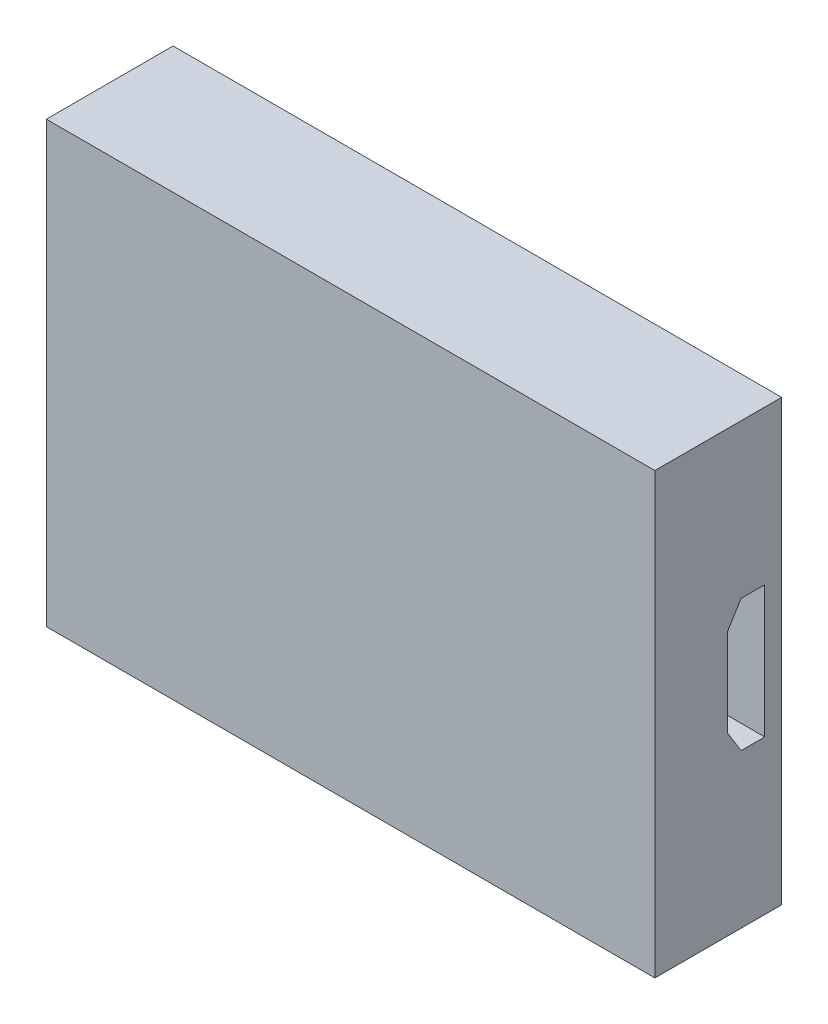
ISO-10303-21;
HEADER;
FILE_DESCRIPTION(('STEP AP214'),'2;1');
FILE_NAME('part.step','',(''),(''),'','','');
FILE_SCHEMA(('AUTOMOTIVE_DESIGN { 1 0 10303 214 1 1 1 1 }'));
ENDSEC;
DATA;
#1=APPLICATION_CONTEXT('core data for automotive mechanical design processes');
#2=APPLICATION_PROTOCOL_DEFINITION('international standard','automotive_design',2000,#1);
#3=PRODUCT_CONTEXT('',#1,'mechanical');
#4=PRODUCT('Part','Part','',(#3));
#5=PRODUCT_RELATED_PRODUCT_CATEGORY('part','',(#4));
#6=PRODUCT_DEFINITION_FORMATION('','',#4);
#7=PRODUCT_DEFINITION_CONTEXT('part definition',#1,'design');
#8=PRODUCT_DEFINITION('design','',#6,#7);
#9=PRODUCT_DEFINITION_SHAPE('','',#8);
#10=(LENGTH_UNIT() NAMED_UNIT(*) SI_UNIT(.MILLI.,.METRE.));
#11=(NAMED_UNIT(*) PLANE_ANGLE_UNIT() SI_UNIT($,.RADIAN.));
#12=(NAMED_UNIT(*) SI_UNIT($,.STERADIAN.) SOLID_ANGLE_UNIT());
#13=UNCERTAINTY_MEASURE_WITH_UNIT(LENGTH_MEASURE(1.E-05),#10,'distance_accuracy_value','');
#14=(GEOMETRIC_REPRESENTATION_CONTEXT(3) GLOBAL_UNCERTAINTY_ASSIGNED_CONTEXT((#13)) GLOBAL_UNIT_ASSIGNED_CONTEXT((#10,
#11,#12)) REPRESENTATION_CONTEXT('',''));
#15=CARTESIAN_POINT('',(0.,0.,0.));
#16=DIRECTION('',(0.,0.,1.));
#17=DIRECTION('',(1.,0.,0.));
#18=AXIS2_PLACEMENT_3D('',#15,#16,#17);
#19=CARTESIAN_POINT('',(0.,13.,-5.5));
#20=DIRECTION('',(0.,1.,0.));
#21=DIRECTION('',(-1.,0.,0.));
#22=AXIS2_PLACEMENT_3D('',#19,#20,#21);
#23=PLANE('',#22);
#24=DIRECTION('',(0.,0.,1.));
#25=VECTOR('',#24,1.);
#26=CARTESIAN_POINT('',(-19.25,13.,-5.5));
#27=LINE('',#26,#25);
#28=CARTESIAN_POINT('',(-19.25,13.,-5.5));
#29=VERTEX_POINT('',#28);
#30=CARTESIAN_POINT('',(-19.25,13.,2.));
#31=VERTEX_POINT('',#30);
#32=EDGE_CURVE('E61',#29,#31,#27,.T.);
#33=ORIENTED_EDGE('',*,*,#32,.T.);
#34=DIRECTION('',(-1.,0.,0.));
#35=VECTOR('',#34,1.);
#36=CARTESIAN_POINT('',(0.,13.,2.));
#37=LINE('',#36,#35);
#38=CARTESIAN_POINT('',(16.75,13.,2.));
#39=VERTEX_POINT('',#38);
#40=EDGE_CURVE('E171',#39,#31,#37,.T.);
#41=ORIENTED_EDGE('',*,*,#40,.F.);
#42=DIRECTION('',(0.,0.,1.));
#43=VECTOR('',#42,1.);
#44=CARTESIAN_POINT('',(16.75,13.,-5.5));
#45=LINE('',#44,#43);
#46=CARTESIAN_POINT('',(16.75,13.,-5.5));
#47=VERTEX_POINT('',#46);
#48=EDGE_CURVE('E12',#47,#39,#45,.T.);
#49=ORIENTED_EDGE('',*,*,#48,.F.);
#50=DIRECTION('',(-1.,0.,0.));
#51=VECTOR('',#50,1.);
#52=CARTESIAN_POINT('',(0.,13.,-5.5));
#53=LINE('',#52,#51);
#54=EDGE_CURVE('E258',#47,#29,#53,.T.);
#55=ORIENTED_EDGE('',*,*,#54,.T.);
#56=EDGE_LOOP('',(#33,#41,#49,#55));
#57=FACE_BOUND('',#56,.T.);
#58=ADVANCED_FACE('F58',(#57),#23,.T.);
#59=CARTESIAN_POINT('',(16.75,0.,-5.5));
#60=DIRECTION('',(-1.,0.,0.));
#61=DIRECTION('',(0.,-1.,0.));
#62=AXIS2_PLACEMENT_3D('',#59,#60,#61);
#63=PLANE('',#62);
#64=DIRECTION('',(0.,-0.851658316704544,0.524097425664335));
#65=VECTOR('',#64,1.);
#66=CARTESIAN_POINT('',(16.75,3.9,-3.1));
#67=LINE('',#66,#65);
#68=CARTESIAN_POINT('',(16.75,3.9,-3.1));
#69=VERTEX_POINT('',#68);
#70=CARTESIAN_POINT('',(16.75,2.6,-2.3));
#71=VERTEX_POINT('',#70);
#72=EDGE_CURVE('E207',#69,#71,#67,.T.);
#73=ORIENTED_EDGE('',*,*,#72,.F.);
#74=DIRECTION('',(0.,0.,1.));
#75=VECTOR('',#74,1.);
#76=CARTESIAN_POINT('',(16.75,3.9,-4.5));
#77=LINE('',#76,#75);
#78=CARTESIAN_POINT('',(16.75,3.9,-4.5));
#79=VERTEX_POINT('',#78);
#80=EDGE_CURVE('E74',#79,#69,#77,.T.);
#81=ORIENTED_EDGE('',*,*,#80,.F.);
#82=DIRECTION('',(0.,1.,0.));
#83=VECTOR('',#82,1.);
#84=CARTESIAN_POINT('',(16.75,-3.9,-4.5));
#85=LINE('',#84,#83);
#86=CARTESIAN_POINT('',(16.75,-3.9,-4.5));
#87=VERTEX_POINT('',#86);
#88=EDGE_CURVE('E194',#87,#79,#85,.T.);
#89=ORIENTED_EDGE('',*,*,#88,.F.);
#90=DIRECTION('',(0.,0.,-1.));
#91=VECTOR('',#90,1.);
#92=CARTESIAN_POINT('',(16.75,-3.9,-4.5));
#93=LINE('',#92,#91);
#94=CARTESIAN_POINT('',(16.75,-3.9,-3.1));
#95=VERTEX_POINT('',#94);
#96=EDGE_CURVE('E198',#95,#87,#93,.T.);
#97=ORIENTED_EDGE('',*,*,#96,.F.);
#98=DIRECTION('',(0.,-0.851658316704544,-0.524097425664335));
#99=VECTOR('',#98,1.);
#100=CARTESIAN_POINT('',(16.75,-3.9,-3.1));
#101=LINE('',#100,#99);
#102=CARTESIAN_POINT('',(16.75,-2.6,-2.3));
#103=VERTEX_POINT('',#102);
#104=EDGE_CURVE('E201',#103,#95,#101,.T.);
#105=ORIENTED_EDGE('',*,*,#104,.F.);
#106=DIRECTION('',(0.,-1.,0.));
#107=VECTOR('',#106,1.);
#108=CARTESIAN_POINT('',(16.75,-2.6,-2.3));
#109=LINE('',#108,#107);
#110=EDGE_CURVE('E204',#71,#103,#109,.T.);
#111=ORIENTED_EDGE('',*,*,#110,.F.);
#112=EDGE_LOOP('',(#73,#81,#89,#97,#105,#111));
#113=FACE_BOUND('',#112,.T.);
#114=ORIENTED_EDGE('',*,*,#48,.T.);
#115=DIRECTION('',(0.,-1.,0.));
#116=VECTOR('',#115,1.);
#117=CARTESIAN_POINT('',(16.75,0.,2.));
#118=LINE('',#117,#116);
#119=CARTESIAN_POINT('',(16.75,-13.,2.));
#120=VERTEX_POINT('',#119);
#121=EDGE_CURVE('E164',#39,#120,#118,.T.);
#122=ORIENTED_EDGE('',*,*,#121,.T.);
#123=DIRECTION('',(0.,0.,1.));
#124=VECTOR('',#123,1.);
#125=CARTESIAN_POINT('',(16.75,-13.,-5.5));
#126=LINE('',#125,#124);
#127=CARTESIAN_POINT('',(16.75,-13.,-5.5));
#128=VERTEX_POINT('',#127);
#129=EDGE_CURVE('E66',#128,#120,#126,.T.);
#130=ORIENTED_EDGE('',*,*,#129,.F.);
#131=DIRECTION('',(0.,-1.,0.));
#132=VECTOR('',#131,1.);
#133=CARTESIAN_POINT('',(16.75,0.,-5.5));
#134=LINE('',#133,#132);
#135=EDGE_CURVE('E166',#47,#128,#134,.T.);
#136=ORIENTED_EDGE('',*,*,#135,.F.);
#137=EDGE_LOOP('',(#114,#122,#130,#136));
#138=FACE_BOUND('',#137,.T.);
#139=ADVANCED_FACE('F161',(#113,#138),#63,.F.);
#140=CARTESIAN_POINT('',(0.,-13.,-5.5));
#141=DIRECTION('',(0.,1.,0.));
#142=DIRECTION('',(-1.,0.,0.));
#143=AXIS2_PLACEMENT_3D('',#140,#141,#142);
#144=PLANE('',#143);
#145=ORIENTED_EDGE('',*,*,#129,.T.);
#146=DIRECTION('',(-1.,0.,0.));
#147=VECTOR('',#146,1.);
#148=CARTESIAN_POINT('',(0.,-13.,2.));
#149=LINE('',#148,#147);
#150=CARTESIAN_POINT('',(-19.25,-13.,2.));
#151=VERTEX_POINT('',#150);
#152=EDGE_CURVE('E179',#120,#151,#149,.T.);
#153=ORIENTED_EDGE('',*,*,#152,.T.);
#154=DIRECTION('',(0.,0.,1.));
#155=VECTOR('',#154,1.);
#156=CARTESIAN_POINT('',(-19.25,-13.,-5.5));
#157=LINE('',#156,#155);
#158=CARTESIAN_POINT('',(-19.25,-13.,-5.5));
#159=VERTEX_POINT('',#158);
#160=EDGE_CURVE('E274',#159,#151,#157,.T.);
#161=ORIENTED_EDGE('',*,*,#160,.F.);
#162=DIRECTION('',(-1.,0.,0.));
#163=VECTOR('',#162,1.);
#164=CARTESIAN_POINT('',(0.,-13.,-5.5));
#165=LINE('',#164,#163);
#166=EDGE_CURVE('E271',#128,#159,#165,.T.);
#167=ORIENTED_EDGE('',*,*,#166,.F.);
#168=EDGE_LOOP('',(#145,#153,#161,#167));
#169=FACE_BOUND('',#168,.T.);
#170=ADVANCED_FACE('F281',(#169),#144,.F.);
#171=CARTESIAN_POINT('',(-19.25,0.,-5.5));
#172=DIRECTION('',(-1.,0.,0.));
#173=DIRECTION('',(0.,-1.,0.));
#174=AXIS2_PLACEMENT_3D('',#171,#172,#173);
#175=PLANE('',#174);
#176=CARTESIAN_POINT('',(-19.25,4.2,-2.5));
#177=DIRECTION('',(-1.,0.,0.));
#178=DIRECTION('',(0.,-1.,0.));
#179=AXIS2_PLACEMENT_3D('',#176,#177,#178);
#180=CIRCLE('',#179,0.5);
#181=CARTESIAN_POINT('',(-19.25,3.7,-2.5));
#182=VERTEX_POINT('',#181);
#183=EDGE_CURVE('E424',#182,#182,#180,.T.);
#184=ORIENTED_EDGE('',*,*,#183,.F.);
#185=EDGE_LOOP('',(#184));
#186=FACE_BOUND('',#185,.T.);
#187=CARTESIAN_POINT('',(-19.25,-4.2,-2.5));
#188=DIRECTION('',(-1.,0.,0.));
#189=DIRECTION('',(0.,1.,0.));
#190=AXIS2_PLACEMENT_3D('',#187,#188,#189);
#191=CIRCLE('',#190,0.5);
#192=CARTESIAN_POINT('',(-19.25,-3.7,-2.5));
#193=VERTEX_POINT('',#192);
#194=EDGE_CURVE('E432',#193,#193,#191,.T.);
#195=ORIENTED_EDGE('',*,*,#194,.F.);
#196=EDGE_LOOP('',(#195));
#197=FACE_BOUND('',#196,.T.);
#198=ORIENTED_EDGE('',*,*,#160,.T.);
#199=DIRECTION('',(0.,-1.,0.));
#200=VECTOR('',#199,1.);
#201=CARTESIAN_POINT('',(-19.25,0.,2.));
#202=LINE('',#201,#200);
#203=EDGE_CURVE('E175',#31,#151,#202,.T.);
#204=ORIENTED_EDGE('',*,*,#203,.F.);
#205=ORIENTED_EDGE('',*,*,#32,.F.);
#206=DIRECTION('',(0.,-1.,0.));
#207=VECTOR('',#206,1.);
#208=CARTESIAN_POINT('',(-19.25,0.,-5.5));
#209=LINE('',#208,#207);
#210=EDGE_CURVE('E268',#29,#159,#209,.T.);
#211=ORIENTED_EDGE('',*,*,#210,.T.);
#212=EDGE_LOOP('',(#198,#204,#205,#211));
#213=FACE_BOUND('',#212,.T.);
#214=ADVANCED_FACE('F277',(#186,#197,#213),#175,.T.);
#215=CARTESIAN_POINT('',(0.,0.,-5.5));
#216=DIRECTION('',(0.,0.,1.));
#217=DIRECTION('',(1.,0.,0.));
#218=AXIS2_PLACEMENT_3D('',#215,#216,#217);
#219=PLANE('',#218);
#220=CARTESIAN_POINT('',(14.7499999999998,-11.,-5.5));
#221=DIRECTION('',(0.,0.,-1.));
#222=DIRECTION('',(-1.,0.,0.));
#223=AXIS2_PLACEMENT_3D('',#220,#221,#222);
#224=CIRCLE('',#223,1.25);
#225=CARTESIAN_POINT('',(13.4999999999998,-11.,-5.5));
#226=VERTEX_POINT('',#225);
#227=EDGE_CURVE('E425',#226,#226,#224,.T.);
#228=ORIENTED_EDGE('',*,*,#227,.F.);
#229=EDGE_LOOP('',(#228));
#230=FACE_BOUND('',#229,.T.);
#231=CARTESIAN_POINT('',(-17.2500000000002,-11.,-5.5));
#232=DIRECTION('',(0.,0.,-1.));
#233=DIRECTION('',(-1.,0.,0.));
#234=AXIS2_PLACEMENT_3D('',#231,#232,#233);
#235=CIRCLE('',#234,1.25);
#236=CARTESIAN_POINT('',(-18.5000000000002,-11.,-5.5));
#237=VERTEX_POINT('',#236);
#238=EDGE_CURVE('E445',#237,#237,#235,.T.);
#239=ORIENTED_EDGE('',*,*,#238,.F.);
#240=EDGE_LOOP('',(#239));
#241=FACE_BOUND('',#240,.T.);
#242=CARTESIAN_POINT('',(-17.25,11.,-5.5));
#243=DIRECTION('',(0.,0.,-1.));
#244=DIRECTION('',(-1.,0.,0.));
#245=AXIS2_PLACEMENT_3D('',#242,#243,#244);
#246=CIRCLE('',#245,1.25);
#247=CARTESIAN_POINT('',(-18.5,11.,-5.5));
#248=VERTEX_POINT('',#247);
#249=EDGE_CURVE('E439',#248,#248,#246,.T.);
#250=ORIENTED_EDGE('',*,*,#249,.F.);
#251=EDGE_LOOP('',(#250));
#252=FACE_BOUND('',#251,.T.);
#253=CARTESIAN_POINT('',(14.75,11.,-5.5));
#254=DIRECTION('',(0.,0.,-1.));
#255=DIRECTION('',(-1.,0.,0.));
#256=AXIS2_PLACEMENT_3D('',#253,#254,#255);
#257=CIRCLE('',#256,1.25);
#258=CARTESIAN_POINT('',(13.5,11.,-5.5));
#259=VERTEX_POINT('',#258);
#260=EDGE_CURVE('E183',#259,#259,#257,.T.);
#261=ORIENTED_EDGE('',*,*,#260,.F.);
#262=EDGE_LOOP('',(#261));
#263=FACE_BOUND('',#262,.T.);
#264=DIRECTION('',(0.,-1.,0.));
#265=VECTOR('',#264,1.);
#266=CARTESIAN_POINT('',(13.75,0.,-5.5));
#267=LINE('',#266,#265);
#268=CARTESIAN_POINT('',(13.75,10.,-5.5));
#269=VERTEX_POINT('',#268);
#270=CARTESIAN_POINT('',(13.75,-10.,-5.5));
#271=VERTEX_POINT('',#270);
#272=EDGE_CURVE('E244',#269,#271,#267,.T.);
#273=ORIENTED_EDGE('',*,*,#272,.F.);
#274=DIRECTION('',(-1.,0.,0.));
#275=VECTOR('',#274,1.);
#276=CARTESIAN_POINT('',(0.,10.,-5.5));
#277=LINE('',#276,#275);
#278=CARTESIAN_POINT('',(-16.25,10.,-5.5));
#279=VERTEX_POINT('',#278);
#280=EDGE_CURVE('E234',#269,#279,#277,.T.);
#281=ORIENTED_EDGE('',*,*,#280,.T.);
#282=DIRECTION('',(0.,-1.,0.));
#283=VECTOR('',#282,1.);
#284=CARTESIAN_POINT('',(-16.25,0.,-5.5));
#285=LINE('',#284,#283);
#286=CARTESIAN_POINT('',(-16.25,-10.,-5.5));
#287=VERTEX_POINT('',#286);
#288=EDGE_CURVE('E237',#279,#287,#285,.T.);
#289=ORIENTED_EDGE('',*,*,#288,.T.);
#290=DIRECTION('',(-1.,0.,0.));
#291=VECTOR('',#290,1.);
#292=CARTESIAN_POINT('',(0.,-10.,-5.5));
#293=LINE('',#292,#291);
#294=EDGE_CURVE('E241',#271,#287,#293,.T.);
#295=ORIENTED_EDGE('',*,*,#294,.F.);
#296=EDGE_LOOP('',(#273,#281,#289,#295));
#297=FACE_BOUND('',#296,.T.);
#298=ORIENTED_EDGE('',*,*,#54,.F.);
#299=ORIENTED_EDGE('',*,*,#135,.T.);
#300=ORIENTED_EDGE('',*,*,#166,.T.);
#301=ORIENTED_EDGE('',*,*,#210,.F.);
#302=EDGE_LOOP('',(#298,#299,#300,#301));
#303=FACE_BOUND('',#302,.T.);
#304=ADVANCED_FACE('F283',(#230,#241,#252,#263,#297,#303),#219,.F.);
#305=CARTESIAN_POINT('',(0.,10.,-5.5));
#306=DIRECTION('',(0.,1.,0.));
#307=DIRECTION('',(-1.,0.,0.));
#308=AXIS2_PLACEMENT_3D('',#305,#306,#307);
#309=PLANE('',#308);
#310=DIRECTION('',(-1.,0.,0.));
#311=VECTOR('',#310,1.);
#312=CARTESIAN_POINT('',(0.,10.,0.));
#313=LINE('',#312,#311);
#314=CARTESIAN_POINT('',(13.75,10.,0.));
#315=VERTEX_POINT('',#314);
#316=CARTESIAN_POINT('',(-16.25,10.,0.));
#317=VERTEX_POINT('',#316);
#318=EDGE_CURVE('E197',#315,#317,#313,.T.);
#319=ORIENTED_EDGE('',*,*,#318,.T.);
#320=DIRECTION('',(0.,0.,1.));
#321=VECTOR('',#320,1.);
#322=CARTESIAN_POINT('',(-16.25,10.,-5.5));
#323=LINE('',#322,#321);
#324=EDGE_CURVE('E246',#279,#317,#323,.T.);
#325=ORIENTED_EDGE('',*,*,#324,.F.);
#326=ORIENTED_EDGE('',*,*,#280,.F.);
#327=DIRECTION('',(0.,0.,1.));
#328=VECTOR('',#327,1.);
#329=CARTESIAN_POINT('',(13.75,10.,-5.5));
#330=LINE('',#329,#328);
#331=EDGE_CURVE('E255',#269,#315,#330,.T.);
#332=ORIENTED_EDGE('',*,*,#331,.T.);
#333=EDGE_LOOP('',(#319,#325,#326,#332));
#334=FACE_BOUND('',#333,.T.);
#335=ADVANCED_FACE('F285',(#334),#309,.F.);
#336=CARTESIAN_POINT('',(13.75,0.,-5.5));
#337=DIRECTION('',(-1.,0.,0.));
#338=DIRECTION('',(0.,-1.,0.));
#339=AXIS2_PLACEMENT_3D('',#336,#337,#338);
#340=PLANE('',#339);
#341=DIRECTION('',(0.,0.,1.));
#342=VECTOR('',#341,1.);
#343=CARTESIAN_POINT('',(13.75,3.9,-4.5));
#344=LINE('',#343,#342);
#345=CARTESIAN_POINT('',(13.75,3.9,-4.5));
#346=VERTEX_POINT('',#345);
#347=CARTESIAN_POINT('',(13.75,3.9,-3.1));
#348=VERTEX_POINT('',#347);
#349=EDGE_CURVE('E189',#346,#348,#344,.T.);
#350=ORIENTED_EDGE('',*,*,#349,.T.);
#351=DIRECTION('',(0.,-0.851658316704544,0.524097425664335));
#352=VECTOR('',#351,1.);
#353=CARTESIAN_POINT('',(13.75,3.9,-3.1));
#354=LINE('',#353,#352);
#355=CARTESIAN_POINT('',(13.75,2.6,-2.3));
#356=VERTEX_POINT('',#355);
#357=EDGE_CURVE('E190',#348,#356,#354,.T.);
#358=ORIENTED_EDGE('',*,*,#357,.T.);
#359=DIRECTION('',(0.,-1.,0.));
#360=VECTOR('',#359,1.);
#361=CARTESIAN_POINT('',(13.75,-2.6,-2.3));
#362=LINE('',#361,#360);
#363=CARTESIAN_POINT('',(13.75,-2.6,-2.3));
#364=VERTEX_POINT('',#363);
#365=EDGE_CURVE('E225',#356,#364,#362,.T.);
#366=ORIENTED_EDGE('',*,*,#365,.T.);
#367=DIRECTION('',(0.,-0.851658316704544,-0.524097425664335));
#368=VECTOR('',#367,1.);
#369=CARTESIAN_POINT('',(13.75,-3.9,-3.1));
#370=LINE('',#369,#368);
#371=CARTESIAN_POINT('',(13.75,-3.9,-3.1));
#372=VERTEX_POINT('',#371);
#373=EDGE_CURVE('E221',#364,#372,#370,.T.);
#374=ORIENTED_EDGE('',*,*,#373,.T.);
#375=DIRECTION('',(0.,0.,-1.));
#376=VECTOR('',#375,1.);
#377=CARTESIAN_POINT('',(13.75,-3.9,-4.5));
#378=LINE('',#377,#376);
#379=CARTESIAN_POINT('',(13.75,-3.9,-4.5));
#380=VERTEX_POINT('',#379);
#381=EDGE_CURVE('E217',#372,#380,#378,.T.);
#382=ORIENTED_EDGE('',*,*,#381,.T.);
#383=DIRECTION('',(0.,1.,0.));
#384=VECTOR('',#383,1.);
#385=CARTESIAN_POINT('',(13.75,-3.9,-4.5));
#386=LINE('',#385,#384);
#387=EDGE_CURVE('E213',#380,#346,#386,.T.);
#388=ORIENTED_EDGE('',*,*,#387,.T.);
#389=EDGE_LOOP('',(#350,#358,#366,#374,#382,#388));
#390=FACE_BOUND('',#389,.T.);
#391=DIRECTION('',(0.,-1.,0.));
#392=VECTOR('',#391,1.);
#393=CARTESIAN_POINT('',(13.75,0.,0.));
#394=LINE('',#393,#392);
#395=CARTESIAN_POINT('',(13.75,-10.,0.));
#396=VERTEX_POINT('',#395);
#397=EDGE_CURVE('E238',#315,#396,#394,.T.);
#398=ORIENTED_EDGE('',*,*,#397,.F.);
#399=ORIENTED_EDGE('',*,*,#331,.F.);
#400=ORIENTED_EDGE('',*,*,#272,.T.);
#401=DIRECTION('',(0.,0.,1.));
#402=VECTOR('',#401,1.);
#403=CARTESIAN_POINT('',(13.75,-10.,-5.5));
#404=LINE('',#403,#402);
#405=EDGE_CURVE('E259',#271,#396,#404,.T.);
#406=ORIENTED_EDGE('',*,*,#405,.T.);
#407=EDGE_LOOP('',(#398,#399,#400,#406));
#408=FACE_BOUND('',#407,.T.);
#409=ADVANCED_FACE('F292',(#390,#408),#340,.T.);
#410=CARTESIAN_POINT('',(0.,-10.,-5.5));
#411=DIRECTION('',(0.,1.,0.));
#412=DIRECTION('',(-1.,0.,0.));
#413=AXIS2_PLACEMENT_3D('',#410,#411,#412);
#414=PLANE('',#413);
#415=DIRECTION('',(-1.,0.,0.));
#416=VECTOR('',#415,1.);
#417=CARTESIAN_POINT('',(0.,-10.,0.));
#418=LINE('',#417,#416);
#419=CARTESIAN_POINT('',(-16.25,-10.,0.));
#420=VERTEX_POINT('',#419);
#421=EDGE_CURVE('E252',#396,#420,#418,.T.);
#422=ORIENTED_EDGE('',*,*,#421,.F.);
#423=ORIENTED_EDGE('',*,*,#405,.F.);
#424=ORIENTED_EDGE('',*,*,#294,.T.);
#425=DIRECTION('',(0.,0.,1.));
#426=VECTOR('',#425,1.);
#427=CARTESIAN_POINT('',(-16.25,-10.,-5.5));
#428=LINE('',#427,#426);
#429=EDGE_CURVE('E262',#287,#420,#428,.T.);
#430=ORIENTED_EDGE('',*,*,#429,.T.);
#431=EDGE_LOOP('',(#422,#423,#424,#430));
#432=FACE_BOUND('',#431,.T.);
#433=ADVANCED_FACE('F349',(#432),#414,.T.);
#434=CARTESIAN_POINT('',(-16.25,0.,-5.5));
#435=DIRECTION('',(-1.,0.,0.));
#436=DIRECTION('',(0.,-1.,0.));
#437=AXIS2_PLACEMENT_3D('',#434,#435,#436);
#438=PLANE('',#437);
#439=CARTESIAN_POINT('',(-16.25,4.2,-2.5));
#440=DIRECTION('',(-1.,0.,0.));
#441=DIRECTION('',(0.,-1.,0.));
#442=AXIS2_PLACEMENT_3D('',#439,#440,#441);
#443=CIRCLE('',#442,0.5);
#444=CARTESIAN_POINT('',(-16.25,3.7,-2.5));
#445=VERTEX_POINT('',#444);
#446=EDGE_CURVE('E360',#445,#445,#443,.F.);
#447=ORIENTED_EDGE('',*,*,#446,.F.);
#448=EDGE_LOOP('',(#447));
#449=FACE_BOUND('',#448,.T.);
#450=CARTESIAN_POINT('',(-16.25,-4.2,-2.5));
#451=DIRECTION('',(-1.,0.,0.));
#452=DIRECTION('',(0.,-1.,0.));
#453=AXIS2_PLACEMENT_3D('',#450,#451,#452);
#454=CIRCLE('',#453,0.5);
#455=CARTESIAN_POINT('',(-16.25,-4.7,-2.5));
#456=VERTEX_POINT('',#455);
#457=EDGE_CURVE('E364',#456,#456,#454,.F.);
#458=ORIENTED_EDGE('',*,*,#457,.F.);
#459=EDGE_LOOP('',(#458));
#460=FACE_BOUND('',#459,.T.);
#461=DIRECTION('',(0.,-1.,0.));
#462=VECTOR('',#461,1.);
#463=CARTESIAN_POINT('',(-16.25,0.,0.));
#464=LINE('',#463,#462);
#465=EDGE_CURVE('E249',#317,#420,#464,.T.);
#466=ORIENTED_EDGE('',*,*,#465,.T.);
#467=ORIENTED_EDGE('',*,*,#429,.F.);
#468=ORIENTED_EDGE('',*,*,#288,.F.);
#469=ORIENTED_EDGE('',*,*,#324,.T.);
#470=EDGE_LOOP('',(#466,#467,#468,#469));
#471=FACE_BOUND('',#470,.T.);
#472=ADVANCED_FACE('F346',(#449,#460,#471),#438,.F.);
#473=CARTESIAN_POINT('',(-19.251,3.9,-4.5));
#474=DIRECTION('',(0.,1.,0.));
#475=DIRECTION('',(0.,0.,1.));
#476=AXIS2_PLACEMENT_3D('',#473,#474,#475);
#477=PLANE('',#476);
#478=DIRECTION('',(1.,0.,0.));
#479=VECTOR('',#478,1.);
#480=CARTESIAN_POINT('',(-19.251,3.9,-4.5));
#481=LINE('',#480,#479);
#482=EDGE_CURVE('E216',#346,#79,#481,.T.);
#483=ORIENTED_EDGE('',*,*,#482,.T.);
#484=ORIENTED_EDGE('',*,*,#80,.T.);
#485=DIRECTION('',(1.,0.,0.));
#486=VECTOR('',#485,1.);
#487=CARTESIAN_POINT('',(-19.251,3.9,-3.1));
#488=LINE('',#487,#486);
#489=EDGE_CURVE('E212',#348,#69,#488,.T.);
#490=ORIENTED_EDGE('',*,*,#489,.F.);
#491=ORIENTED_EDGE('',*,*,#349,.F.);
#492=EDGE_LOOP('',(#483,#484,#490,#491));
#493=FACE_BOUND('',#492,.T.);
#494=ADVANCED_FACE('F313',(#493),#477,.F.);
#495=CARTESIAN_POINT('',(-19.251,-3.9,-4.5));
#496=DIRECTION('',(0.,0.,-1.));
#497=DIRECTION('',(-1.,0.,0.));
#498=AXIS2_PLACEMENT_3D('',#495,#496,#497);
#499=PLANE('',#498);
#500=DIRECTION('',(1.,0.,0.));
#501=VECTOR('',#500,1.);
#502=CARTESIAN_POINT('',(-19.251,-3.9,-4.5));
#503=LINE('',#502,#501);
#504=EDGE_CURVE('E220',#380,#87,#503,.T.);
#505=ORIENTED_EDGE('',*,*,#504,.T.);
#506=ORIENTED_EDGE('',*,*,#88,.T.);
#507=ORIENTED_EDGE('',*,*,#482,.F.);
#508=ORIENTED_EDGE('',*,*,#387,.F.);
#509=EDGE_LOOP('',(#505,#506,#507,#508));
#510=FACE_BOUND('',#509,.T.);
#511=ADVANCED_FACE('F319',(#510),#499,.F.);
#512=CARTESIAN_POINT('',(-19.251,-3.9,-4.5));
#513=DIRECTION('',(0.,-1.,0.));
#514=DIRECTION('',(0.,0.,-1.));
#515=AXIS2_PLACEMENT_3D('',#512,#513,#514);
#516=PLANE('',#515);
#517=DIRECTION('',(1.,0.,0.));
#518=VECTOR('',#517,1.);
#519=CARTESIAN_POINT('',(-19.251,-3.9,-3.1));
#520=LINE('',#519,#518);
#521=EDGE_CURVE('E224',#372,#95,#520,.T.);
#522=ORIENTED_EDGE('',*,*,#521,.T.);
#523=ORIENTED_EDGE('',*,*,#96,.T.);
#524=ORIENTED_EDGE('',*,*,#504,.F.);
#525=ORIENTED_EDGE('',*,*,#381,.F.);
#526=EDGE_LOOP('',(#522,#523,#524,#525));
#527=FACE_BOUND('',#526,.T.);
#528=ADVANCED_FACE('F321',(#527),#516,.F.);
#529=CARTESIAN_POINT('',(-19.251,-3.9,-3.1));
#530=DIRECTION('',(0.,-0.524097425664335,0.851658316704544));
#531=DIRECTION('',(0.,-0.851658316704544,-0.524097425664335));
#532=AXIS2_PLACEMENT_3D('',#529,#530,#531);
#533=PLANE('',#532);
#534=DIRECTION('',(1.,0.,0.));
#535=VECTOR('',#534,1.);
#536=CARTESIAN_POINT('',(-19.251,-2.6,-2.3));
#537=LINE('',#536,#535);
#538=EDGE_CURVE('E193',#364,#103,#537,.T.);
#539=ORIENTED_EDGE('',*,*,#538,.T.);
#540=ORIENTED_EDGE('',*,*,#104,.T.);
#541=ORIENTED_EDGE('',*,*,#521,.F.);
#542=ORIENTED_EDGE('',*,*,#373,.F.);
#543=EDGE_LOOP('',(#539,#540,#541,#542));
#544=FACE_BOUND('',#543,.T.);
#545=ADVANCED_FACE('F325',(#544),#533,.F.);
#546=CARTESIAN_POINT('',(-19.251,-2.6,-2.3));
#547=DIRECTION('',(0.,0.,1.));
#548=DIRECTION('',(1.,0.,0.));
#549=AXIS2_PLACEMENT_3D('',#546,#547,#548);
#550=PLANE('',#549);
#551=DIRECTION('',(1.,0.,0.));
#552=VECTOR('',#551,1.);
#553=CARTESIAN_POINT('',(-19.251,2.6,-2.3));
#554=LINE('',#553,#552);
#555=EDGE_CURVE('E82',#356,#71,#554,.T.);
#556=ORIENTED_EDGE('',*,*,#555,.T.);
#557=ORIENTED_EDGE('',*,*,#110,.T.);
#558=ORIENTED_EDGE('',*,*,#538,.F.);
#559=ORIENTED_EDGE('',*,*,#365,.F.);
#560=EDGE_LOOP('',(#556,#557,#558,#559));
#561=FACE_BOUND('',#560,.T.);
#562=ADVANCED_FACE('F328',(#561),#550,.F.);
#563=CARTESIAN_POINT('',(-19.251,3.9,-3.1));
#564=DIRECTION('',(0.,0.524097425664335,0.851658316704544));
#565=DIRECTION('',(0.,-0.851658316704544,0.524097425664335));
#566=AXIS2_PLACEMENT_3D('',#563,#564,#565);
#567=PLANE('',#566);
#568=ORIENTED_EDGE('',*,*,#489,.T.);
#569=ORIENTED_EDGE('',*,*,#72,.T.);
#570=ORIENTED_EDGE('',*,*,#555,.F.);
#571=ORIENTED_EDGE('',*,*,#357,.F.);
#572=EDGE_LOOP('',(#568,#569,#570,#571));
#573=FACE_BOUND('',#572,.T.);
#574=ADVANCED_FACE('F312',(#573),#567,.F.);
#575=CARTESIAN_POINT('',(0.,0.,0.));
#576=DIRECTION('',(0.,0.,1.));
#577=DIRECTION('',(1.,0.,0.));
#578=AXIS2_PLACEMENT_3D('',#575,#576,#577);
#579=PLANE('',#578);
#580=ORIENTED_EDGE('',*,*,#318,.F.);
#581=ORIENTED_EDGE('',*,*,#397,.T.);
#582=ORIENTED_EDGE('',*,*,#421,.T.);
#583=ORIENTED_EDGE('',*,*,#465,.F.);
#584=EDGE_LOOP('',(#580,#581,#582,#583));
#585=FACE_BOUND('',#584,.T.);
#586=ADVANCED_FACE('F335',(#585),#579,.F.);
#587=CARTESIAN_POINT('',(0.,0.,2.));
#588=DIRECTION('',(0.,0.,1.));
#589=DIRECTION('',(1.,0.,0.));
#590=AXIS2_PLACEMENT_3D('',#587,#588,#589);
#591=PLANE('',#590);
#592=ORIENTED_EDGE('',*,*,#121,.F.);
#593=ORIENTED_EDGE('',*,*,#40,.T.);
#594=ORIENTED_EDGE('',*,*,#203,.T.);
#595=ORIENTED_EDGE('',*,*,#152,.F.);
#596=EDGE_LOOP('',(#592,#593,#594,#595));
#597=FACE_BOUND('',#596,.T.);
#598=ADVANCED_FACE('F177',(#597),#591,.T.);
#599=CARTESIAN_POINT('',(14.75,11.,-0.5));
#600=DIRECTION('',(0.,0.,-1.));
#601=DIRECTION('',(-1.,0.,0.));
#602=AXIS2_PLACEMENT_3D('',#599,#600,#601);
#603=CYLINDRICAL_SURFACE('',#602,1.25);
#604=CARTESIAN_POINT('',(14.75,11.,-0.5));
#605=DIRECTION('',(0.,0.,-1.));
#606=DIRECTION('',(-1.,0.,0.));
#607=AXIS2_PLACEMENT_3D('',#604,#605,#606);
#608=CIRCLE('',#607,1.25);
#609=CARTESIAN_POINT('',(13.5,11.,-0.5));
#610=VERTEX_POINT('',#609);
#611=EDGE_CURVE('E180',#610,#610,#608,.T.);
#612=ORIENTED_EDGE('',*,*,#611,.F.);
#613=EDGE_LOOP('',(#612));
#614=FACE_BOUND('',#613,.T.);
#615=ORIENTED_EDGE('',*,*,#260,.T.);
#616=EDGE_LOOP('',(#615));
#617=FACE_BOUND('',#616,.T.);
#618=ADVANCED_FACE('F378',(#614,#617),#603,.F.);
#619=CARTESIAN_POINT('',(14.75,11.,-0.5));
#620=DIRECTION('',(0.,0.,-1.));
#621=DIRECTION('',(-1.,0.,0.));
#622=AXIS2_PLACEMENT_3D('',#619,#620,#621);
#623=PLANE('',#622);
#624=ORIENTED_EDGE('',*,*,#611,.T.);
#625=EDGE_LOOP('',(#624));
#626=FACE_BOUND('',#625,.T.);
#627=ADVANCED_FACE('F383',(#626),#623,.T.);
#628=CARTESIAN_POINT('',(-17.25,11.,-0.5));
#629=DIRECTION('',(0.,0.,-1.));
#630=DIRECTION('',(-1.,0.,0.));
#631=AXIS2_PLACEMENT_3D('',#628,#629,#630);
#632=CYLINDRICAL_SURFACE('',#631,1.25);
#633=CARTESIAN_POINT('',(-17.25,11.,-0.5));
#634=DIRECTION('',(0.,0.,-1.));
#635=DIRECTION('',(-1.,0.,0.));
#636=AXIS2_PLACEMENT_3D('',#633,#634,#635);
#637=CIRCLE('',#636,1.25);
#638=CARTESIAN_POINT('',(-18.5,11.,-0.5));
#639=VERTEX_POINT('',#638);
#640=EDGE_CURVE('E436',#639,#639,#637,.T.);
#641=ORIENTED_EDGE('',*,*,#640,.F.);
#642=EDGE_LOOP('',(#641));
#643=FACE_BOUND('',#642,.T.);
#644=ORIENTED_EDGE('',*,*,#249,.T.);
#645=EDGE_LOOP('',(#644));
#646=FACE_BOUND('',#645,.T.);
#647=ADVANCED_FACE('F387',(#643,#646),#632,.F.);
#648=CARTESIAN_POINT('',(-17.25,11.,-0.5));
#649=DIRECTION('',(0.,0.,-1.));
#650=DIRECTION('',(-1.,0.,0.));
#651=AXIS2_PLACEMENT_3D('',#648,#649,#650);
#652=PLANE('',#651);
#653=ORIENTED_EDGE('',*,*,#640,.T.);
#654=EDGE_LOOP('',(#653));
#655=FACE_BOUND('',#654,.T.);
#656=ADVANCED_FACE('F402',(#655),#652,.T.);
#657=CARTESIAN_POINT('',(-17.2500000000002,-11.,-0.5));
#658=DIRECTION('',(0.,0.,-1.));
#659=DIRECTION('',(-1.,0.,0.));
#660=AXIS2_PLACEMENT_3D('',#657,#658,#659);
#661=CYLINDRICAL_SURFACE('',#660,1.25);
#662=CARTESIAN_POINT('',(-17.2500000000002,-11.,-0.5));
#663=DIRECTION('',(0.,0.,-1.));
#664=DIRECTION('',(-1.,0.,0.));
#665=AXIS2_PLACEMENT_3D('',#662,#663,#664);
#666=CIRCLE('',#665,1.25);
#667=CARTESIAN_POINT('',(-18.5000000000002,-11.,-0.5));
#668=VERTEX_POINT('',#667);
#669=EDGE_CURVE('E442',#668,#668,#666,.T.);
#670=ORIENTED_EDGE('',*,*,#669,.F.);
#671=EDGE_LOOP('',(#670));
#672=FACE_BOUND('',#671,.T.);
#673=ORIENTED_EDGE('',*,*,#238,.T.);
#674=EDGE_LOOP('',(#673));
#675=FACE_BOUND('',#674,.T.);
#676=ADVANCED_FACE('F399',(#672,#675),#661,.F.);
#677=CARTESIAN_POINT('',(-17.2500000000002,-11.,-0.5));
#678=DIRECTION('',(0.,0.,-1.));
#679=DIRECTION('',(-1.,0.,0.));
#680=AXIS2_PLACEMENT_3D('',#677,#678,#679);
#681=PLANE('',#680);
#682=ORIENTED_EDGE('',*,*,#669,.T.);
#683=EDGE_LOOP('',(#682));
#684=FACE_BOUND('',#683,.T.);
#685=ADVANCED_FACE('F393',(#684),#681,.T.);
#686=CARTESIAN_POINT('',(14.7499999999998,-11.,-0.5));
#687=DIRECTION('',(0.,0.,-1.));
#688=DIRECTION('',(-1.,0.,0.));
#689=AXIS2_PLACEMENT_3D('',#686,#687,#688);
#690=CYLINDRICAL_SURFACE('',#689,1.25);
#691=CARTESIAN_POINT('',(14.7499999999998,-11.,-0.5));
#692=DIRECTION('',(0.,0.,-1.));
#693=DIRECTION('',(-1.,0.,0.));
#694=AXIS2_PLACEMENT_3D('',#691,#692,#693);
#695=CIRCLE('',#694,1.25);
#696=CARTESIAN_POINT('',(13.4999999999998,-11.,-0.5));
#697=VERTEX_POINT('',#696);
#698=EDGE_CURVE('E428',#697,#697,#695,.T.);
#699=ORIENTED_EDGE('',*,*,#698,.F.);
#700=EDGE_LOOP('',(#699));
#701=FACE_BOUND('',#700,.T.);
#702=ORIENTED_EDGE('',*,*,#227,.T.);
#703=EDGE_LOOP('',(#702));
#704=FACE_BOUND('',#703,.T.);
#705=ADVANCED_FACE('F389',(#701,#704),#690,.F.);
#706=CARTESIAN_POINT('',(14.7499999999998,-11.,-0.5));
#707=DIRECTION('',(0.,0.,-1.));
#708=DIRECTION('',(-1.,0.,0.));
#709=AXIS2_PLACEMENT_3D('',#706,#707,#708);
#710=PLANE('',#709);
#711=ORIENTED_EDGE('',*,*,#698,.T.);
#712=EDGE_LOOP('',(#711));
#713=FACE_BOUND('',#712,.T.);
#714=ADVANCED_FACE('F392',(#713),#710,.T.);
#715=CARTESIAN_POINT('',(16.751,-4.2,-2.5));
#716=DIRECTION('',(-1.,0.,0.));
#717=DIRECTION('',(0.,-1.,0.));
#718=AXIS2_PLACEMENT_3D('',#715,#716,#717);
#719=CYLINDRICAL_SURFACE('',#718,0.5);
#720=ORIENTED_EDGE('',*,*,#194,.T.);
#721=EDGE_LOOP('',(#720));
#722=FACE_BOUND('',#721,.T.);
#723=ORIENTED_EDGE('',*,*,#457,.T.);
#724=EDGE_LOOP('',(#723));
#725=FACE_BOUND('',#724,.T.);
#726=ADVANCED_FACE('F397',(#722,#725),#719,.F.);
#727=CARTESIAN_POINT('',(16.751,4.2,-2.5));
#728=DIRECTION('',(-1.,0.,0.));
#729=DIRECTION('',(0.,-1.,0.));
#730=AXIS2_PLACEMENT_3D('',#727,#728,#729);
#731=CYLINDRICAL_SURFACE('',#730,0.5);
#732=ORIENTED_EDGE('',*,*,#183,.T.);
#733=EDGE_LOOP('',(#732));
#734=FACE_BOUND('',#733,.T.);
#735=ORIENTED_EDGE('',*,*,#446,.T.);
#736=EDGE_LOOP('',(#735));
#737=FACE_BOUND('',#736,.T.);
#738=ADVANCED_FACE('F415',(#734,#737),#731,.F.);
#739=CLOSED_SHELL('',(#58,#139,#170,#214,#304,#335,#409,#433,#472,#494,#511,#528,#545,#562,#574,
#586,#598,#618,#627,#647,#656,#676,#685,#705,#714,#726,#738));
#740=MANIFOLD_SOLID_BREP('B2',#739);
#741=ADVANCED_BREP_SHAPE_REPRESENTATION('',(#18,#740),#14);
#742=SHAPE_DEFINITION_REPRESENTATION(#9,#741);
ENDSEC;
END-ISO-10303-21;
